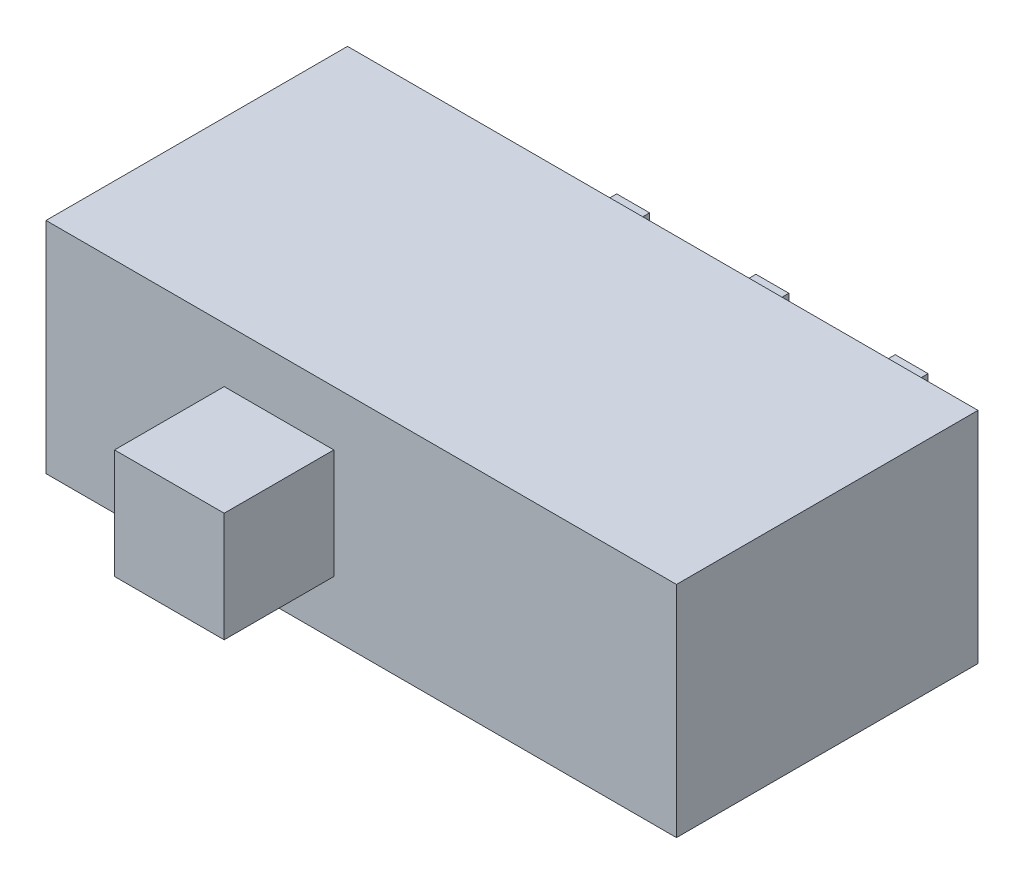
ISO-10303-21;
HEADER;
FILE_DESCRIPTION(('STEP AP214'),'2;1');
FILE_NAME('part.step','',(''),(''),'','','');
FILE_SCHEMA(('AUTOMOTIVE_DESIGN { 1 0 10303 214 1 1 1 1 }'));
ENDSEC;
DATA;
#1=APPLICATION_CONTEXT('core data for automotive mechanical design processes');
#2=APPLICATION_PROTOCOL_DEFINITION('international standard','automotive_design',2000,#1);
#3=PRODUCT_CONTEXT('',#1,'mechanical');
#4=PRODUCT('Part','Part','',(#3));
#5=PRODUCT_RELATED_PRODUCT_CATEGORY('part','',(#4));
#6=PRODUCT_DEFINITION_FORMATION('','',#4);
#7=PRODUCT_DEFINITION_CONTEXT('part definition',#1,'design');
#8=PRODUCT_DEFINITION('design','',#6,#7);
#9=PRODUCT_DEFINITION_SHAPE('','',#8);
#10=(LENGTH_UNIT() NAMED_UNIT(*) SI_UNIT(.MILLI.,.METRE.));
#11=(NAMED_UNIT(*) PLANE_ANGLE_UNIT() SI_UNIT($,.RADIAN.));
#12=(NAMED_UNIT(*) SI_UNIT($,.STERADIAN.) SOLID_ANGLE_UNIT());
#13=UNCERTAINTY_MEASURE_WITH_UNIT(LENGTH_MEASURE(1.E-05),#10,'distance_accuracy_value','');
#14=(GEOMETRIC_REPRESENTATION_CONTEXT(3) GLOBAL_UNCERTAINTY_ASSIGNED_CONTEXT((#13)) GLOBAL_UNIT_ASSIGNED_CONTEXT((#10,
#11,#12)) REPRESENTATION_CONTEXT('',''));
#15=CARTESIAN_POINT('',(0.,0.,0.));
#16=DIRECTION('',(0.,0.,1.));
#17=DIRECTION('',(1.,0.,0.));
#18=AXIS2_PLACEMENT_3D('',#15,#16,#17);
#19=CARTESIAN_POINT('',(-5.75,2.,-2.75));
#20=DIRECTION('',(0.,0.,1.));
#21=DIRECTION('',(1.,0.,0.));
#22=AXIS2_PLACEMENT_3D('',#19,#20,#21);
#23=PLANE('',#22);
#24=DIRECTION('',(0.,1.,0.));
#25=VECTOR('',#24,1.);
#26=CARTESIAN_POINT('',(2.24,-0.125,-2.75));
#27=LINE('',#26,#25);
#28=CARTESIAN_POINT('',(2.24,-0.125,-2.75));
#29=VERTEX_POINT('',#28);
#30=CARTESIAN_POINT('',(2.24,0.125,-2.75));
#31=VERTEX_POINT('',#30);
#32=EDGE_CURVE('E191',#29,#31,#27,.T.);
#33=ORIENTED_EDGE('',*,*,#32,.F.);
#34=DIRECTION('',(-1.,0.,0.));
#35=VECTOR('',#34,1.);
#36=CARTESIAN_POINT('',(2.84,-0.125,-2.75));
#37=LINE('',#36,#35);
#38=CARTESIAN_POINT('',(2.84,-0.125,-2.75));
#39=VERTEX_POINT('',#38);
#40=EDGE_CURVE('E204',#39,#29,#37,.T.);
#41=ORIENTED_EDGE('',*,*,#40,.F.);
#42=DIRECTION('',(0.,-1.,0.));
#43=VECTOR('',#42,1.);
#44=CARTESIAN_POINT('',(2.84,-0.125,-2.75));
#45=LINE('',#44,#43);
#46=CARTESIAN_POINT('',(2.84,0.125,-2.75));
#47=VERTEX_POINT('',#46);
#48=EDGE_CURVE('E213',#47,#39,#45,.T.);
#49=ORIENTED_EDGE('',*,*,#48,.F.);
#50=DIRECTION('',(1.,0.,0.));
#51=VECTOR('',#50,1.);
#52=CARTESIAN_POINT('',(2.84,0.125,-2.75));
#53=LINE('',#52,#51);
#54=EDGE_CURVE('E194',#31,#47,#53,.T.);
#55=ORIENTED_EDGE('',*,*,#54,.F.);
#56=EDGE_LOOP('',(#33,#41,#49,#55));
#57=FACE_BOUND('',#56,.T.);
#58=DIRECTION('',(-1.,0.,0.));
#59=VECTOR('',#58,1.);
#60=CARTESIAN_POINT('',(-5.75,-2.,-2.75));
#61=LINE('',#60,#59);
#62=CARTESIAN_POINT('',(5.75,-2.,-2.75));
#63=VERTEX_POINT('',#62);
#64=CARTESIAN_POINT('',(-5.75,-2.,-2.75));
#65=VERTEX_POINT('',#64);
#66=EDGE_CURVE('E309',#63,#65,#61,.T.);
#67=ORIENTED_EDGE('',*,*,#66,.T.);
#68=DIRECTION('',(0.,-1.,0.));
#69=VECTOR('',#68,1.);
#70=CARTESIAN_POINT('',(-5.75,2.,-2.75));
#71=LINE('',#70,#69);
#72=CARTESIAN_POINT('',(-5.75,2.,-2.75));
#73=VERTEX_POINT('',#72);
#74=EDGE_CURVE('E41',#73,#65,#71,.T.);
#75=ORIENTED_EDGE('',*,*,#74,.F.);
#76=DIRECTION('',(-1.,0.,0.));
#77=VECTOR('',#76,1.);
#78=CARTESIAN_POINT('',(-5.75,2.,-2.75));
#79=LINE('',#78,#77);
#80=CARTESIAN_POINT('',(5.75,2.,-2.75));
#81=VERTEX_POINT('',#80);
#82=EDGE_CURVE('E299',#81,#73,#79,.T.);
#83=ORIENTED_EDGE('',*,*,#82,.F.);
#84=DIRECTION('',(0.,-1.,0.));
#85=VECTOR('',#84,1.);
#86=CARTESIAN_POINT('',(5.75,2.,-2.75));
#87=LINE('',#86,#85);
#88=EDGE_CURVE('E11',#81,#63,#87,.T.);
#89=ORIENTED_EDGE('',*,*,#88,.T.);
#90=EDGE_LOOP('',(#67,#75,#83,#89));
#91=FACE_BOUND('',#90,.T.);
#92=DIRECTION('',(0.,1.,0.));
#93=VECTOR('',#92,1.);
#94=CARTESIAN_POINT('',(-0.3,-0.125,-2.75));
#95=LINE('',#94,#93);
#96=CARTESIAN_POINT('',(-0.3,-0.125,-2.75));
#97=VERTEX_POINT('',#96);
#98=CARTESIAN_POINT('',(-0.3,0.125,-2.75));
#99=VERTEX_POINT('',#98);
#100=EDGE_CURVE('E229',#97,#99,#95,.T.);
#101=ORIENTED_EDGE('',*,*,#100,.F.);
#102=DIRECTION('',(-1.,0.,0.));
#103=VECTOR('',#102,1.);
#104=CARTESIAN_POINT('',(0.3,-0.125,-2.75));
#105=LINE('',#104,#103);
#106=CARTESIAN_POINT('',(0.3,-0.125,-2.75));
#107=VERTEX_POINT('',#106);
#108=EDGE_CURVE('E234',#107,#97,#105,.T.);
#109=ORIENTED_EDGE('',*,*,#108,.F.);
#110=DIRECTION('',(0.,-1.,0.));
#111=VECTOR('',#110,1.);
#112=CARTESIAN_POINT('',(0.3,-0.125,-2.75));
#113=LINE('',#112,#111);
#114=CARTESIAN_POINT('',(0.3,0.125,-2.75));
#115=VERTEX_POINT('',#114);
#116=EDGE_CURVE('E246',#115,#107,#113,.T.);
#117=ORIENTED_EDGE('',*,*,#116,.F.);
#118=DIRECTION('',(1.,0.,0.));
#119=VECTOR('',#118,1.);
#120=CARTESIAN_POINT('',(0.3,0.125,-2.75));
#121=LINE('',#120,#119);
#122=EDGE_CURVE('E243',#99,#115,#121,.T.);
#123=ORIENTED_EDGE('',*,*,#122,.F.);
#124=EDGE_LOOP('',(#101,#109,#117,#123));
#125=FACE_BOUND('',#124,.T.);
#126=DIRECTION('',(0.,1.,0.));
#127=VECTOR('',#126,1.);
#128=CARTESIAN_POINT('',(-2.84,-0.125,-2.75));
#129=LINE('',#128,#127);
#130=CARTESIAN_POINT('',(-2.84,-0.125,-2.75));
#131=VERTEX_POINT('',#130);
#132=CARTESIAN_POINT('',(-2.84,0.125,-2.75));
#133=VERTEX_POINT('',#132);
#134=EDGE_CURVE('E190',#131,#133,#129,.T.);
#135=ORIENTED_EDGE('',*,*,#134,.F.);
#136=DIRECTION('',(-1.,0.,0.));
#137=VECTOR('',#136,1.);
#138=CARTESIAN_POINT('',(-2.24,-0.125,-2.75));
#139=LINE('',#138,#137);
#140=CARTESIAN_POINT('',(-2.24,-0.125,-2.75));
#141=VERTEX_POINT('',#140);
#142=EDGE_CURVE('E187',#141,#131,#139,.T.);
#143=ORIENTED_EDGE('',*,*,#142,.F.);
#144=DIRECTION('',(0.,-1.,0.));
#145=VECTOR('',#144,1.);
#146=CARTESIAN_POINT('',(-2.24,-0.125,-2.75));
#147=LINE('',#146,#145);
#148=CARTESIAN_POINT('',(-2.24,0.125,-2.75));
#149=VERTEX_POINT('',#148);
#150=EDGE_CURVE('E53',#149,#141,#147,.T.);
#151=ORIENTED_EDGE('',*,*,#150,.F.);
#152=DIRECTION('',(1.,0.,0.));
#153=VECTOR('',#152,1.);
#154=CARTESIAN_POINT('',(-2.24,0.125,-2.75));
#155=LINE('',#154,#153);
#156=EDGE_CURVE('E48',#133,#149,#155,.T.);
#157=ORIENTED_EDGE('',*,*,#156,.F.);
#158=EDGE_LOOP('',(#135,#143,#151,#157));
#159=FACE_BOUND('',#158,.T.);
#160=ADVANCED_FACE('F33',(#57,#91,#125,#159),#23,.F.);
#161=CARTESIAN_POINT('',(-5.75,2.,2.75));
#162=DIRECTION('',(0.,0.,-1.));
#163=DIRECTION('',(-1.,0.,0.));
#164=AXIS2_PLACEMENT_3D('',#161,#162,#163);
#165=PLANE('',#164);
#166=DIRECTION('',(1.,0.,0.));
#167=VECTOR('',#166,1.);
#168=CARTESIAN_POINT('',(-5.75,-2.,2.75));
#169=LINE('',#168,#167);
#170=CARTESIAN_POINT('',(-5.75,-2.,2.75));
#171=VERTEX_POINT('',#170);
#172=CARTESIAN_POINT('',(5.75,-2.,2.75));
#173=VERTEX_POINT('',#172);
#174=EDGE_CURVE('E300',#171,#173,#169,.T.);
#175=ORIENTED_EDGE('',*,*,#174,.T.);
#176=DIRECTION('',(0.,-1.,0.));
#177=VECTOR('',#176,1.);
#178=CARTESIAN_POINT('',(5.75,2.,2.75));
#179=LINE('',#178,#177);
#180=CARTESIAN_POINT('',(5.75,2.,2.75));
#181=VERTEX_POINT('',#180);
#182=EDGE_CURVE('E306',#181,#173,#179,.T.);
#183=ORIENTED_EDGE('',*,*,#182,.F.);
#184=DIRECTION('',(1.,0.,0.));
#185=VECTOR('',#184,1.);
#186=CARTESIAN_POINT('',(-5.75,2.,2.75));
#187=LINE('',#186,#185);
#188=CARTESIAN_POINT('',(-5.75,2.,2.75));
#189=VERTEX_POINT('',#188);
#190=EDGE_CURVE('E304',#189,#181,#187,.T.);
#191=ORIENTED_EDGE('',*,*,#190,.F.);
#192=DIRECTION('',(0.,-1.,0.));
#193=VECTOR('',#192,1.);
#194=CARTESIAN_POINT('',(-5.75,2.,2.75));
#195=LINE('',#194,#193);
#196=EDGE_CURVE('E316',#189,#171,#195,.T.);
#197=ORIENTED_EDGE('',*,*,#196,.T.);
#198=EDGE_LOOP('',(#175,#183,#191,#197));
#199=FACE_BOUND('',#198,.T.);
#200=DIRECTION('',(0.,1.,0.));
#201=VECTOR('',#200,1.);
#202=CARTESIAN_POINT('',(-0.5,-1.,2.75));
#203=LINE('',#202,#201);
#204=CARTESIAN_POINT('',(-0.5,-1.,2.75));
#205=VERTEX_POINT('',#204);
#206=CARTESIAN_POINT('',(-0.5,1.,2.75));
#207=VERTEX_POINT('',#206);
#208=EDGE_CURVE('E262',#205,#207,#203,.T.);
#209=ORIENTED_EDGE('',*,*,#208,.F.);
#210=DIRECTION('',(1.,0.,0.));
#211=VECTOR('',#210,1.);
#212=CARTESIAN_POINT('',(-2.5,-1.,2.75));
#213=LINE('',#212,#211);
#214=CARTESIAN_POINT('',(-2.5,-1.,2.75));
#215=VERTEX_POINT('',#214);
#216=EDGE_CURVE('E267',#215,#205,#213,.T.);
#217=ORIENTED_EDGE('',*,*,#216,.F.);
#218=DIRECTION('',(0.,-1.,0.));
#219=VECTOR('',#218,1.);
#220=CARTESIAN_POINT('',(-2.5,-1.,2.75));
#221=LINE('',#220,#219);
#222=CARTESIAN_POINT('',(-2.5,1.,2.75));
#223=VERTEX_POINT('',#222);
#224=EDGE_CURVE('E279',#223,#215,#221,.T.);
#225=ORIENTED_EDGE('',*,*,#224,.F.);
#226=DIRECTION('',(-1.,0.,0.));
#227=VECTOR('',#226,1.);
#228=CARTESIAN_POINT('',(-2.5,1.,2.75));
#229=LINE('',#228,#227);
#230=EDGE_CURVE('E276',#207,#223,#229,.T.);
#231=ORIENTED_EDGE('',*,*,#230,.F.);
#232=EDGE_LOOP('',(#209,#217,#225,#231));
#233=FACE_BOUND('',#232,.T.);
#234=ADVANCED_FACE('F332',(#199,#233),#165,.F.);
#235=CARTESIAN_POINT('',(5.75,2.,2.75));
#236=DIRECTION('',(-1.,0.,0.));
#237=DIRECTION('',(0.,0.,1.));
#238=AXIS2_PLACEMENT_3D('',#235,#236,#237);
#239=PLANE('',#238);
#240=DIRECTION('',(0.,0.,-1.));
#241=VECTOR('',#240,1.);
#242=CARTESIAN_POINT('',(5.75,-2.,2.75));
#243=LINE('',#242,#241);
#244=EDGE_CURVE('E295',#173,#63,#243,.T.);
#245=ORIENTED_EDGE('',*,*,#244,.T.);
#246=ORIENTED_EDGE('',*,*,#88,.F.);
#247=DIRECTION('',(0.,0.,-1.));
#248=VECTOR('',#247,1.);
#249=CARTESIAN_POINT('',(5.75,2.,2.75));
#250=LINE('',#249,#248);
#251=EDGE_CURVE('E296',#181,#81,#250,.T.);
#252=ORIENTED_EDGE('',*,*,#251,.F.);
#253=ORIENTED_EDGE('',*,*,#182,.T.);
#254=EDGE_LOOP('',(#245,#246,#252,#253));
#255=FACE_BOUND('',#254,.T.);
#256=ADVANCED_FACE('F35',(#255),#239,.F.);
#257=CARTESIAN_POINT('',(-5.75,2.,2.75));
#258=DIRECTION('',(1.,0.,0.));
#259=DIRECTION('',(0.,0.,-1.));
#260=AXIS2_PLACEMENT_3D('',#257,#258,#259);
#261=PLANE('',#260);
#262=DIRECTION('',(0.,0.,1.));
#263=VECTOR('',#262,1.);
#264=CARTESIAN_POINT('',(-5.75,-2.,2.75));
#265=LINE('',#264,#263);
#266=EDGE_CURVE('E311',#65,#171,#265,.T.);
#267=ORIENTED_EDGE('',*,*,#266,.T.);
#268=ORIENTED_EDGE('',*,*,#196,.F.);
#269=DIRECTION('',(0.,0.,1.));
#270=VECTOR('',#269,1.);
#271=CARTESIAN_POINT('',(-5.75,2.,2.75));
#272=LINE('',#271,#270);
#273=EDGE_CURVE('E302',#73,#189,#272,.T.);
#274=ORIENTED_EDGE('',*,*,#273,.F.);
#275=ORIENTED_EDGE('',*,*,#74,.T.);
#276=EDGE_LOOP('',(#267,#268,#274,#275));
#277=FACE_BOUND('',#276,.T.);
#278=ADVANCED_FACE('F323',(#277),#261,.F.);
#279=CARTESIAN_POINT('',(0.,2.,0.));
#280=DIRECTION('',(0.,-1.,0.));
#281=DIRECTION('',(0.,0.,-1.));
#282=AXIS2_PLACEMENT_3D('',#279,#280,#281);
#283=PLANE('',#282);
#284=ORIENTED_EDGE('',*,*,#251,.T.);
#285=ORIENTED_EDGE('',*,*,#82,.T.);
#286=ORIENTED_EDGE('',*,*,#273,.T.);
#287=ORIENTED_EDGE('',*,*,#190,.T.);
#288=EDGE_LOOP('',(#284,#285,#286,#287));
#289=FACE_BOUND('',#288,.T.);
#290=ADVANCED_FACE('F339',(#289),#283,.F.);
#291=CARTESIAN_POINT('',(0.,-2.,0.));
#292=DIRECTION('',(0.,-1.,0.));
#293=DIRECTION('',(0.,0.,-1.));
#294=AXIS2_PLACEMENT_3D('',#291,#292,#293);
#295=PLANE('',#294);
#296=ORIENTED_EDGE('',*,*,#244,.F.);
#297=ORIENTED_EDGE('',*,*,#174,.F.);
#298=ORIENTED_EDGE('',*,*,#266,.F.);
#299=ORIENTED_EDGE('',*,*,#66,.F.);
#300=EDGE_LOOP('',(#296,#297,#298,#299));
#301=FACE_BOUND('',#300,.T.);
#302=ADVANCED_FACE('F329',(#301),#295,.T.);
#303=CARTESIAN_POINT('',(-0.5,-1.,4.75));
#304=DIRECTION('',(-1.,0.,0.));
#305=DIRECTION('',(0.,0.,1.));
#306=AXIS2_PLACEMENT_3D('',#303,#304,#305);
#307=PLANE('',#306);
#308=ORIENTED_EDGE('',*,*,#208,.T.);
#309=DIRECTION('',(0.,0.,-1.));
#310=VECTOR('',#309,1.);
#311=CARTESIAN_POINT('',(-0.5,1.,4.75));
#312=LINE('',#311,#310);
#313=CARTESIAN_POINT('',(-0.5,1.,4.75));
#314=VERTEX_POINT('',#313);
#315=EDGE_CURVE('E292',#314,#207,#312,.T.);
#316=ORIENTED_EDGE('',*,*,#315,.F.);
#317=DIRECTION('',(0.,1.,0.));
#318=VECTOR('',#317,1.);
#319=CARTESIAN_POINT('',(-0.5,-1.,4.75));
#320=LINE('',#319,#318);
#321=CARTESIAN_POINT('',(-0.5,-1.,4.75));
#322=VERTEX_POINT('',#321);
#323=EDGE_CURVE('E263',#322,#314,#320,.T.);
#324=ORIENTED_EDGE('',*,*,#323,.F.);
#325=DIRECTION('',(0.,0.,-1.));
#326=VECTOR('',#325,1.);
#327=CARTESIAN_POINT('',(-0.5,-1.,4.75));
#328=LINE('',#327,#326);
#329=EDGE_CURVE('E273',#322,#205,#328,.T.);
#330=ORIENTED_EDGE('',*,*,#329,.T.);
#331=EDGE_LOOP('',(#308,#316,#324,#330));
#332=FACE_BOUND('',#331,.T.);
#333=ADVANCED_FACE('F425',(#332),#307,.F.);
#334=CARTESIAN_POINT('',(-2.5,1.,4.75));
#335=DIRECTION('',(0.,-1.,0.));
#336=DIRECTION('',(0.,0.,-1.));
#337=AXIS2_PLACEMENT_3D('',#334,#335,#336);
#338=PLANE('',#337);
#339=ORIENTED_EDGE('',*,*,#230,.T.);
#340=DIRECTION('',(0.,0.,-1.));
#341=VECTOR('',#340,1.);
#342=CARTESIAN_POINT('',(-2.5,1.,4.75));
#343=LINE('',#342,#341);
#344=CARTESIAN_POINT('',(-2.5,1.,4.75));
#345=VERTEX_POINT('',#344);
#346=EDGE_CURVE('E289',#345,#223,#343,.T.);
#347=ORIENTED_EDGE('',*,*,#346,.F.);
#348=DIRECTION('',(-1.,0.,0.));
#349=VECTOR('',#348,1.);
#350=CARTESIAN_POINT('',(-2.5,1.,4.75));
#351=LINE('',#350,#349);
#352=EDGE_CURVE('E266',#314,#345,#351,.T.);
#353=ORIENTED_EDGE('',*,*,#352,.F.);
#354=ORIENTED_EDGE('',*,*,#315,.T.);
#355=EDGE_LOOP('',(#339,#347,#353,#354));
#356=FACE_BOUND('',#355,.T.);
#357=ADVANCED_FACE('F421',(#356),#338,.F.);
#358=CARTESIAN_POINT('',(-2.5,-1.,4.75));
#359=DIRECTION('',(1.,0.,0.));
#360=DIRECTION('',(0.,0.,-1.));
#361=AXIS2_PLACEMENT_3D('',#358,#359,#360);
#362=PLANE('',#361);
#363=ORIENTED_EDGE('',*,*,#224,.T.);
#364=DIRECTION('',(0.,0.,-1.));
#365=VECTOR('',#364,1.);
#366=CARTESIAN_POINT('',(-2.5,-1.,4.75));
#367=LINE('',#366,#365);
#368=CARTESIAN_POINT('',(-2.5,-1.,4.75));
#369=VERTEX_POINT('',#368);
#370=EDGE_CURVE('E286',#369,#215,#367,.T.);
#371=ORIENTED_EDGE('',*,*,#370,.F.);
#372=DIRECTION('',(0.,-1.,0.));
#373=VECTOR('',#372,1.);
#374=CARTESIAN_POINT('',(-2.5,-1.,4.75));
#375=LINE('',#374,#373);
#376=EDGE_CURVE('E269',#345,#369,#375,.T.);
#377=ORIENTED_EDGE('',*,*,#376,.F.);
#378=ORIENTED_EDGE('',*,*,#346,.T.);
#379=EDGE_LOOP('',(#363,#371,#377,#378));
#380=FACE_BOUND('',#379,.T.);
#381=ADVANCED_FACE('F417',(#380),#362,.F.);
#382=CARTESIAN_POINT('',(-2.5,-1.,4.75));
#383=DIRECTION('',(0.,1.,0.));
#384=DIRECTION('',(0.,0.,1.));
#385=AXIS2_PLACEMENT_3D('',#382,#383,#384);
#386=PLANE('',#385);
#387=ORIENTED_EDGE('',*,*,#216,.T.);
#388=ORIENTED_EDGE('',*,*,#329,.F.);
#389=DIRECTION('',(1.,0.,0.));
#390=VECTOR('',#389,1.);
#391=CARTESIAN_POINT('',(-2.5,-1.,4.75));
#392=LINE('',#391,#390);
#393=EDGE_CURVE('E271',#369,#322,#392,.T.);
#394=ORIENTED_EDGE('',*,*,#393,.F.);
#395=ORIENTED_EDGE('',*,*,#370,.T.);
#396=EDGE_LOOP('',(#387,#388,#394,#395));
#397=FACE_BOUND('',#396,.T.);
#398=ADVANCED_FACE('F413',(#397),#386,.F.);
#399=CARTESIAN_POINT('',(0.,0.,4.75));
#400=DIRECTION('',(0.,0.,-1.));
#401=DIRECTION('',(-1.,0.,0.));
#402=AXIS2_PLACEMENT_3D('',#399,#400,#401);
#403=PLANE('',#402);
#404=ORIENTED_EDGE('',*,*,#323,.T.);
#405=ORIENTED_EDGE('',*,*,#352,.T.);
#406=ORIENTED_EDGE('',*,*,#376,.T.);
#407=ORIENTED_EDGE('',*,*,#393,.T.);
#408=EDGE_LOOP('',(#404,#405,#406,#407));
#409=FACE_BOUND('',#408,.T.);
#410=ADVANCED_FACE('F409',(#409),#403,.F.);
#411=CARTESIAN_POINT('',(-0.3,-0.125,-4.75));
#412=DIRECTION('',(1.,0.,0.));
#413=DIRECTION('',(0.,0.,-1.));
#414=AXIS2_PLACEMENT_3D('',#411,#412,#413);
#415=PLANE('',#414);
#416=ORIENTED_EDGE('',*,*,#100,.T.);
#417=DIRECTION('',(0.,0.,1.));
#418=VECTOR('',#417,1.);
#419=CARTESIAN_POINT('',(-0.3,0.125,-4.75));
#420=LINE('',#419,#418);
#421=CARTESIAN_POINT('',(-0.3,0.125,-4.75));
#422=VERTEX_POINT('',#421);
#423=EDGE_CURVE('E259',#422,#99,#420,.T.);
#424=ORIENTED_EDGE('',*,*,#423,.F.);
#425=DIRECTION('',(0.,1.,0.));
#426=VECTOR('',#425,1.);
#427=CARTESIAN_POINT('',(-0.3,-0.125,-4.75));
#428=LINE('',#427,#426);
#429=CARTESIAN_POINT('',(-0.3,-0.125,-4.75));
#430=VERTEX_POINT('',#429);
#431=EDGE_CURVE('E230',#430,#422,#428,.T.);
#432=ORIENTED_EDGE('',*,*,#431,.F.);
#433=DIRECTION('',(0.,0.,1.));
#434=VECTOR('',#433,1.);
#435=CARTESIAN_POINT('',(-0.3,-0.125,-4.75));
#436=LINE('',#435,#434);
#437=EDGE_CURVE('E240',#430,#97,#436,.T.);
#438=ORIENTED_EDGE('',*,*,#437,.T.);
#439=EDGE_LOOP('',(#416,#424,#432,#438));
#440=FACE_BOUND('',#439,.T.);
#441=ADVANCED_FACE('F405',(#440),#415,.F.);
#442=CARTESIAN_POINT('',(0.3,0.125,-4.75));
#443=DIRECTION('',(0.,-1.,0.));
#444=DIRECTION('',(0.,0.,-1.));
#445=AXIS2_PLACEMENT_3D('',#442,#443,#444);
#446=PLANE('',#445);
#447=ORIENTED_EDGE('',*,*,#122,.T.);
#448=DIRECTION('',(0.,0.,1.));
#449=VECTOR('',#448,1.);
#450=CARTESIAN_POINT('',(0.3,0.125,-4.75));
#451=LINE('',#450,#449);
#452=CARTESIAN_POINT('',(0.3,0.125,-4.75));
#453=VERTEX_POINT('',#452);
#454=EDGE_CURVE('E256',#453,#115,#451,.T.);
#455=ORIENTED_EDGE('',*,*,#454,.F.);
#456=DIRECTION('',(1.,0.,0.));
#457=VECTOR('',#456,1.);
#458=CARTESIAN_POINT('',(0.3,0.125,-4.75));
#459=LINE('',#458,#457);
#460=EDGE_CURVE('E233',#422,#453,#459,.T.);
#461=ORIENTED_EDGE('',*,*,#460,.F.);
#462=ORIENTED_EDGE('',*,*,#423,.T.);
#463=EDGE_LOOP('',(#447,#455,#461,#462));
#464=FACE_BOUND('',#463,.T.);
#465=ADVANCED_FACE('F401',(#464),#446,.F.);
#466=CARTESIAN_POINT('',(0.3,-0.125,-4.75));
#467=DIRECTION('',(-1.,0.,0.));
#468=DIRECTION('',(0.,0.,1.));
#469=AXIS2_PLACEMENT_3D('',#466,#467,#468);
#470=PLANE('',#469);
#471=ORIENTED_EDGE('',*,*,#116,.T.);
#472=DIRECTION('',(0.,0.,1.));
#473=VECTOR('',#472,1.);
#474=CARTESIAN_POINT('',(0.3,-0.125,-4.75));
#475=LINE('',#474,#473);
#476=CARTESIAN_POINT('',(0.3,-0.125,-4.75));
#477=VERTEX_POINT('',#476);
#478=EDGE_CURVE('E253',#477,#107,#475,.T.);
#479=ORIENTED_EDGE('',*,*,#478,.F.);
#480=DIRECTION('',(0.,-1.,0.));
#481=VECTOR('',#480,1.);
#482=CARTESIAN_POINT('',(0.3,-0.125,-4.75));
#483=LINE('',#482,#481);
#484=EDGE_CURVE('E236',#453,#477,#483,.T.);
#485=ORIENTED_EDGE('',*,*,#484,.F.);
#486=ORIENTED_EDGE('',*,*,#454,.T.);
#487=EDGE_LOOP('',(#471,#479,#485,#486));
#488=FACE_BOUND('',#487,.T.);
#489=ADVANCED_FACE('F397',(#488),#470,.F.);
#490=CARTESIAN_POINT('',(0.3,-0.125,-4.75));
#491=DIRECTION('',(0.,1.,0.));
#492=DIRECTION('',(0.,0.,1.));
#493=AXIS2_PLACEMENT_3D('',#490,#491,#492);
#494=PLANE('',#493);
#495=ORIENTED_EDGE('',*,*,#108,.T.);
#496=ORIENTED_EDGE('',*,*,#437,.F.);
#497=DIRECTION('',(-1.,0.,0.));
#498=VECTOR('',#497,1.);
#499=CARTESIAN_POINT('',(0.3,-0.125,-4.75));
#500=LINE('',#499,#498);
#501=EDGE_CURVE('E238',#477,#430,#500,.T.);
#502=ORIENTED_EDGE('',*,*,#501,.F.);
#503=ORIENTED_EDGE('',*,*,#478,.T.);
#504=EDGE_LOOP('',(#495,#496,#502,#503));
#505=FACE_BOUND('',#504,.T.);
#506=ADVANCED_FACE('F393',(#505),#494,.F.);
#507=CARTESIAN_POINT('',(0.,0.,-4.75));
#508=DIRECTION('',(0.,0.,1.));
#509=DIRECTION('',(1.,0.,0.));
#510=AXIS2_PLACEMENT_3D('',#507,#508,#509);
#511=PLANE('',#510);
#512=ORIENTED_EDGE('',*,*,#431,.T.);
#513=ORIENTED_EDGE('',*,*,#460,.T.);
#514=ORIENTED_EDGE('',*,*,#484,.T.);
#515=ORIENTED_EDGE('',*,*,#501,.T.);
#516=EDGE_LOOP('',(#512,#513,#514,#515));
#517=FACE_BOUND('',#516,.T.);
#518=ADVANCED_FACE('F389',(#517),#511,.F.);
#519=CARTESIAN_POINT('',(2.24,-0.125,-4.75));
#520=DIRECTION('',(1.,0.,0.));
#521=DIRECTION('',(0.,0.,-1.));
#522=AXIS2_PLACEMENT_3D('',#519,#520,#521);
#523=PLANE('',#522);
#524=ORIENTED_EDGE('',*,*,#32,.T.);
#525=DIRECTION('',(0.,0.,1.));
#526=VECTOR('',#525,1.);
#527=CARTESIAN_POINT('',(2.24,0.125,-4.75));
#528=LINE('',#527,#526);
#529=CARTESIAN_POINT('',(2.24,0.125,-4.75));
#530=VERTEX_POINT('',#529);
#531=EDGE_CURVE('E226',#530,#31,#528,.T.);
#532=ORIENTED_EDGE('',*,*,#531,.F.);
#533=DIRECTION('',(0.,1.,0.));
#534=VECTOR('',#533,1.);
#535=CARTESIAN_POINT('',(2.24,-0.125,-4.75));
#536=LINE('',#535,#534);
#537=CARTESIAN_POINT('',(2.24,-0.125,-4.75));
#538=VERTEX_POINT('',#537);
#539=EDGE_CURVE('E200',#538,#530,#536,.T.);
#540=ORIENTED_EDGE('',*,*,#539,.F.);
#541=DIRECTION('',(0.,0.,1.));
#542=VECTOR('',#541,1.);
#543=CARTESIAN_POINT('',(2.24,-0.125,-4.75));
#544=LINE('',#543,#542);
#545=EDGE_CURVE('E209',#538,#29,#544,.T.);
#546=ORIENTED_EDGE('',*,*,#545,.T.);
#547=EDGE_LOOP('',(#524,#532,#540,#546));
#548=FACE_BOUND('',#547,.T.);
#549=ADVANCED_FACE('F385',(#548),#523,.F.);
#550=CARTESIAN_POINT('',(2.84,0.125,-4.75));
#551=DIRECTION('',(0.,-1.,0.));
#552=DIRECTION('',(0.,0.,-1.));
#553=AXIS2_PLACEMENT_3D('',#550,#551,#552);
#554=PLANE('',#553);
#555=ORIENTED_EDGE('',*,*,#54,.T.);
#556=DIRECTION('',(0.,0.,1.));
#557=VECTOR('',#556,1.);
#558=CARTESIAN_POINT('',(2.84,0.125,-4.75));
#559=LINE('',#558,#557);
#560=CARTESIAN_POINT('',(2.84,0.125,-4.75));
#561=VERTEX_POINT('',#560);
#562=EDGE_CURVE('E223',#561,#47,#559,.T.);
#563=ORIENTED_EDGE('',*,*,#562,.F.);
#564=DIRECTION('',(1.,0.,0.));
#565=VECTOR('',#564,1.);
#566=CARTESIAN_POINT('',(2.84,0.125,-4.75));
#567=LINE('',#566,#565);
#568=EDGE_CURVE('E203',#530,#561,#567,.T.);
#569=ORIENTED_EDGE('',*,*,#568,.F.);
#570=ORIENTED_EDGE('',*,*,#531,.T.);
#571=EDGE_LOOP('',(#555,#563,#569,#570));
#572=FACE_BOUND('',#571,.T.);
#573=ADVANCED_FACE('F381',(#572),#554,.F.);
#574=CARTESIAN_POINT('',(2.84,-0.125,-4.75));
#575=DIRECTION('',(-1.,0.,0.));
#576=DIRECTION('',(0.,0.,1.));
#577=AXIS2_PLACEMENT_3D('',#574,#575,#576);
#578=PLANE('',#577);
#579=ORIENTED_EDGE('',*,*,#48,.T.);
#580=DIRECTION('',(0.,0.,1.));
#581=VECTOR('',#580,1.);
#582=CARTESIAN_POINT('',(2.84,-0.125,-4.75));
#583=LINE('',#582,#581);
#584=CARTESIAN_POINT('',(2.84,-0.125,-4.75));
#585=VERTEX_POINT('',#584);
#586=EDGE_CURVE('E220',#585,#39,#583,.T.);
#587=ORIENTED_EDGE('',*,*,#586,.F.);
#588=DIRECTION('',(0.,-1.,0.));
#589=VECTOR('',#588,1.);
#590=CARTESIAN_POINT('',(2.84,-0.125,-4.75));
#591=LINE('',#590,#589);
#592=EDGE_CURVE('E206',#561,#585,#591,.T.);
#593=ORIENTED_EDGE('',*,*,#592,.F.);
#594=ORIENTED_EDGE('',*,*,#562,.T.);
#595=EDGE_LOOP('',(#579,#587,#593,#594));
#596=FACE_BOUND('',#595,.T.);
#597=ADVANCED_FACE('F377',(#596),#578,.F.);
#598=CARTESIAN_POINT('',(2.84,-0.125,-4.75));
#599=DIRECTION('',(0.,1.,0.));
#600=DIRECTION('',(0.,0.,1.));
#601=AXIS2_PLACEMENT_3D('',#598,#599,#600);
#602=PLANE('',#601);
#603=ORIENTED_EDGE('',*,*,#40,.T.);
#604=ORIENTED_EDGE('',*,*,#545,.F.);
#605=DIRECTION('',(-1.,0.,0.));
#606=VECTOR('',#605,1.);
#607=CARTESIAN_POINT('',(2.84,-0.125,-4.75));
#608=LINE('',#607,#606);
#609=EDGE_CURVE('E208',#585,#538,#608,.T.);
#610=ORIENTED_EDGE('',*,*,#609,.F.);
#611=ORIENTED_EDGE('',*,*,#586,.T.);
#612=EDGE_LOOP('',(#603,#604,#610,#611));
#613=FACE_BOUND('',#612,.T.);
#614=ADVANCED_FACE('F373',(#613),#602,.F.);
#615=CARTESIAN_POINT('',(0.,0.,-4.75));
#616=DIRECTION('',(0.,0.,1.));
#617=DIRECTION('',(1.,0.,0.));
#618=AXIS2_PLACEMENT_3D('',#615,#616,#617);
#619=PLANE('',#618);
#620=ORIENTED_EDGE('',*,*,#539,.T.);
#621=ORIENTED_EDGE('',*,*,#568,.T.);
#622=ORIENTED_EDGE('',*,*,#592,.T.);
#623=ORIENTED_EDGE('',*,*,#609,.T.);
#624=EDGE_LOOP('',(#620,#621,#622,#623));
#625=FACE_BOUND('',#624,.T.);
#626=ADVANCED_FACE('F370',(#625),#619,.F.);
#627=CARTESIAN_POINT('',(-2.84,-0.125,-4.75));
#628=DIRECTION('',(1.,0.,0.));
#629=DIRECTION('',(0.,0.,-1.));
#630=AXIS2_PLACEMENT_3D('',#627,#628,#629);
#631=PLANE('',#630);
#632=ORIENTED_EDGE('',*,*,#134,.T.);
#633=DIRECTION('',(0.,0.,1.));
#634=VECTOR('',#633,1.);
#635=CARTESIAN_POINT('',(-2.84,0.125,-4.75));
#636=LINE('',#635,#634);
#637=CARTESIAN_POINT('',(-2.84,0.125,-4.75));
#638=VERTEX_POINT('',#637);
#639=EDGE_CURVE('E171',#638,#133,#636,.T.);
#640=ORIENTED_EDGE('',*,*,#639,.F.);
#641=DIRECTION('',(0.,1.,0.));
#642=VECTOR('',#641,1.);
#643=CARTESIAN_POINT('',(-2.84,-0.125,-4.75));
#644=LINE('',#643,#642);
#645=CARTESIAN_POINT('',(-2.84,-0.125,-4.75));
#646=VERTEX_POINT('',#645);
#647=EDGE_CURVE('E178',#646,#638,#644,.T.);
#648=ORIENTED_EDGE('',*,*,#647,.F.);
#649=DIRECTION('',(0.,0.,1.));
#650=VECTOR('',#649,1.);
#651=CARTESIAN_POINT('',(-2.84,-0.125,-4.75));
#652=LINE('',#651,#650);
#653=EDGE_CURVE('E348',#646,#131,#652,.T.);
#654=ORIENTED_EDGE('',*,*,#653,.T.);
#655=EDGE_LOOP('',(#632,#640,#648,#654));
#656=FACE_BOUND('',#655,.T.);
#657=ADVANCED_FACE('F189',(#656),#631,.F.);
#658=CARTESIAN_POINT('',(-2.24,0.125,-4.75));
#659=DIRECTION('',(0.,-1.,0.));
#660=DIRECTION('',(0.,0.,-1.));
#661=AXIS2_PLACEMENT_3D('',#658,#659,#660);
#662=PLANE('',#661);
#663=ORIENTED_EDGE('',*,*,#156,.T.);
#664=DIRECTION('',(0.,0.,1.));
#665=VECTOR('',#664,1.);
#666=CARTESIAN_POINT('',(-2.24,0.125,-4.75));
#667=LINE('',#666,#665);
#668=CARTESIAN_POINT('',(-2.24,0.125,-4.75));
#669=VERTEX_POINT('',#668);
#670=EDGE_CURVE('E174',#669,#149,#667,.T.);
#671=ORIENTED_EDGE('',*,*,#670,.F.);
#672=DIRECTION('',(1.,0.,0.));
#673=VECTOR('',#672,1.);
#674=CARTESIAN_POINT('',(-2.24,0.125,-4.75));
#675=LINE('',#674,#673);
#676=EDGE_CURVE('E167',#638,#669,#675,.T.);
#677=ORIENTED_EDGE('',*,*,#676,.F.);
#678=ORIENTED_EDGE('',*,*,#639,.T.);
#679=EDGE_LOOP('',(#663,#671,#677,#678));
#680=FACE_BOUND('',#679,.T.);
#681=ADVANCED_FACE('F169',(#680),#662,.F.);
#682=CARTESIAN_POINT('',(-2.24,-0.125,-4.75));
#683=DIRECTION('',(-1.,0.,0.));
#684=DIRECTION('',(0.,0.,1.));
#685=AXIS2_PLACEMENT_3D('',#682,#683,#684);
#686=PLANE('',#685);
#687=ORIENTED_EDGE('',*,*,#150,.T.);
#688=DIRECTION('',(0.,0.,1.));
#689=VECTOR('',#688,1.);
#690=CARTESIAN_POINT('',(-2.24,-0.125,-4.75));
#691=LINE('',#690,#689);
#692=CARTESIAN_POINT('',(-2.24,-0.125,-4.75));
#693=VERTEX_POINT('',#692);
#694=EDGE_CURVE('E196',#693,#141,#691,.T.);
#695=ORIENTED_EDGE('',*,*,#694,.F.);
#696=DIRECTION('',(0.,-1.,0.));
#697=VECTOR('',#696,1.);
#698=CARTESIAN_POINT('',(-2.24,-0.125,-4.75));
#699=LINE('',#698,#697);
#700=EDGE_CURVE('E177',#669,#693,#699,.T.);
#701=ORIENTED_EDGE('',*,*,#700,.F.);
#702=ORIENTED_EDGE('',*,*,#670,.T.);
#703=EDGE_LOOP('',(#687,#695,#701,#702));
#704=FACE_BOUND('',#703,.T.);
#705=ADVANCED_FACE('F357',(#704),#686,.F.);
#706=CARTESIAN_POINT('',(-2.24,-0.125,-4.75));
#707=DIRECTION('',(0.,1.,0.));
#708=DIRECTION('',(0.,0.,1.));
#709=AXIS2_PLACEMENT_3D('',#706,#707,#708);
#710=PLANE('',#709);
#711=ORIENTED_EDGE('',*,*,#142,.T.);
#712=ORIENTED_EDGE('',*,*,#653,.F.);
#713=DIRECTION('',(-1.,0.,0.));
#714=VECTOR('',#713,1.);
#715=CARTESIAN_POINT('',(-2.24,-0.125,-4.75));
#716=LINE('',#715,#714);
#717=EDGE_CURVE('E183',#693,#646,#716,.T.);
#718=ORIENTED_EDGE('',*,*,#717,.F.);
#719=ORIENTED_EDGE('',*,*,#694,.T.);
#720=EDGE_LOOP('',(#711,#712,#718,#719));
#721=FACE_BOUND('',#720,.T.);
#722=ADVANCED_FACE('F347',(#721),#710,.F.);
#723=CARTESIAN_POINT('',(0.,0.,-4.75));
#724=DIRECTION('',(0.,0.,1.));
#725=DIRECTION('',(1.,0.,0.));
#726=AXIS2_PLACEMENT_3D('',#723,#724,#725);
#727=PLANE('',#726);
#728=ORIENTED_EDGE('',*,*,#647,.T.);
#729=ORIENTED_EDGE('',*,*,#676,.T.);
#730=ORIENTED_EDGE('',*,*,#700,.T.);
#731=ORIENTED_EDGE('',*,*,#717,.T.);
#732=EDGE_LOOP('',(#728,#729,#730,#731));
#733=FACE_BOUND('',#732,.T.);
#734=ADVANCED_FACE('F181',(#733),#727,.F.);
#735=CLOSED_SHELL('',(#160,#234,#256,#278,#290,#302,#333,#357,#381,#398,#410,#441,#465,#489,
#506,#518,#549,#573,#597,#614,#626,#657,#681,#705,#722,#734));
#736=MANIFOLD_SOLID_BREP('B2',#735);
#737=ADVANCED_BREP_SHAPE_REPRESENTATION('',(#18,#736),#14);
#738=SHAPE_DEFINITION_REPRESENTATION(#9,#737);
ENDSEC;
END-ISO-10303-21;
